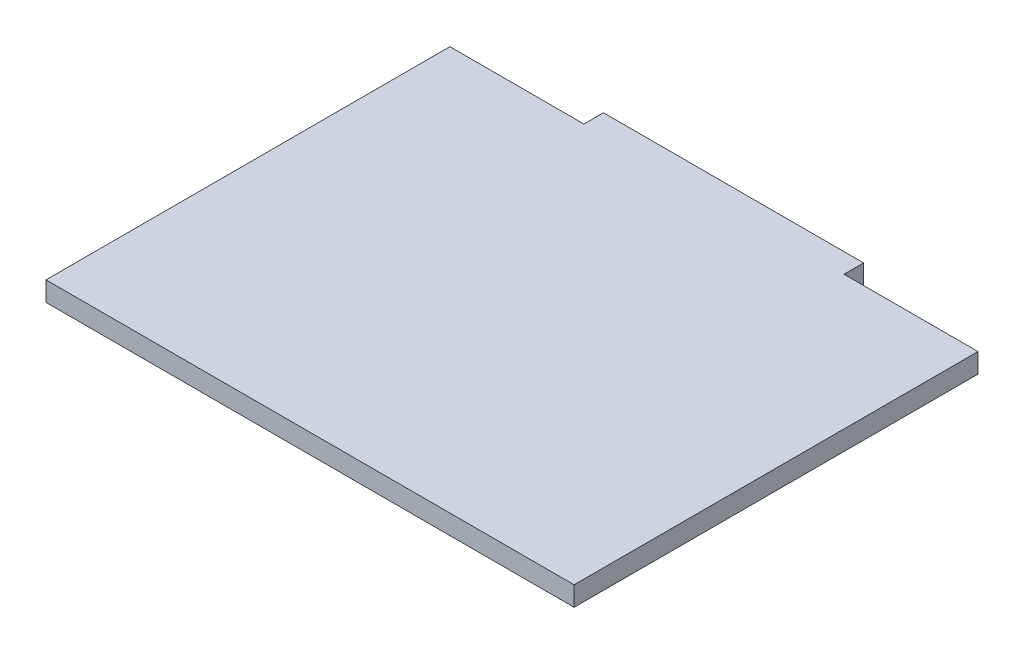
ISO-10303-21;
HEADER;
FILE_DESCRIPTION(('STEP AP214'),'2;1');
FILE_NAME('part.step','',(''),(''),'','','');
FILE_SCHEMA(('AUTOMOTIVE_DESIGN { 1 0 10303 214 1 1 1 1 }'));
ENDSEC;
DATA;
#1=APPLICATION_CONTEXT('core data for automotive mechanical design processes');
#2=APPLICATION_PROTOCOL_DEFINITION('international standard','automotive_design',2000,#1);
#3=PRODUCT_CONTEXT('',#1,'mechanical');
#4=PRODUCT('Part','Part','',(#3));
#5=PRODUCT_RELATED_PRODUCT_CATEGORY('part','',(#4));
#6=PRODUCT_DEFINITION_FORMATION('','',#4);
#7=PRODUCT_DEFINITION_CONTEXT('part definition',#1,'design');
#8=PRODUCT_DEFINITION('design','',#6,#7);
#9=PRODUCT_DEFINITION_SHAPE('','',#8);
#10=(LENGTH_UNIT() NAMED_UNIT(*) SI_UNIT(.MILLI.,.METRE.));
#11=(NAMED_UNIT(*) PLANE_ANGLE_UNIT() SI_UNIT($,.RADIAN.));
#12=(NAMED_UNIT(*) SI_UNIT($,.STERADIAN.) SOLID_ANGLE_UNIT());
#13=UNCERTAINTY_MEASURE_WITH_UNIT(LENGTH_MEASURE(1.E-05),#10,'distance_accuracy_value','');
#14=(GEOMETRIC_REPRESENTATION_CONTEXT(3) GLOBAL_UNCERTAINTY_ASSIGNED_CONTEXT((#13)) GLOBAL_UNIT_ASSIGNED_CONTEXT((#10,
#11,#12)) REPRESENTATION_CONTEXT('',''));
#15=CARTESIAN_POINT('',(0.,0.,0.));
#16=DIRECTION('',(0.,0.,1.));
#17=DIRECTION('',(1.,0.,0.));
#18=AXIS2_PLACEMENT_3D('',#15,#16,#17);
#19=CARTESIAN_POINT('',(0.,1.5,0.));
#20=DIRECTION('',(1.,0.,0.));
#21=DIRECTION('',(0.,0.,-1.));
#22=AXIS2_PLACEMENT_3D('',#19,#20,#21);
#23=PLANE('',#22);
#24=DIRECTION('',(0.,0.,1.));
#25=VECTOR('',#24,1.);
#26=CARTESIAN_POINT('',(0.,0.,0.));
#27=LINE('',#26,#25);
#28=CARTESIAN_POINT('',(0.,0.,-30.975));
#29=VERTEX_POINT('',#28);
#30=CARTESIAN_POINT('',(0.,0.,0.));
#31=VERTEX_POINT('',#30);
#32=EDGE_CURVE('E132',#29,#31,#27,.T.);
#33=ORIENTED_EDGE('',*,*,#32,.T.);
#34=DIRECTION('',(0.,-1.,0.));
#35=VECTOR('',#34,1.);
#36=CARTESIAN_POINT('',(0.,1.5,0.));
#37=LINE('',#36,#35);
#38=CARTESIAN_POINT('',(0.,1.5,0.));
#39=VERTEX_POINT('',#38);
#40=EDGE_CURVE('E11',#39,#31,#37,.T.);
#41=ORIENTED_EDGE('',*,*,#40,.F.);
#42=DIRECTION('',(0.,0.,1.));
#43=VECTOR('',#42,1.);
#44=CARTESIAN_POINT('',(0.,1.5,0.));
#45=LINE('',#44,#43);
#46=CARTESIAN_POINT('',(0.,1.5,-30.975));
#47=VERTEX_POINT('',#46);
#48=EDGE_CURVE('E146',#47,#39,#45,.T.);
#49=ORIENTED_EDGE('',*,*,#48,.F.);
#50=DIRECTION('',(0.,-1.,0.));
#51=VECTOR('',#50,1.);
#52=CARTESIAN_POINT('',(0.,1.5,-30.975));
#53=LINE('',#52,#51);
#54=EDGE_CURVE('E128',#47,#29,#53,.T.);
#55=ORIENTED_EDGE('',*,*,#54,.T.);
#56=EDGE_LOOP('',(#33,#41,#49,#55));
#57=FACE_BOUND('',#56,.T.);
#58=ADVANCED_FACE('F36',(#57),#23,.F.);
#59=CARTESIAN_POINT('',(0.,1.5,0.));
#60=DIRECTION('',(0.,0.,-1.));
#61=DIRECTION('',(-1.,0.,0.));
#62=AXIS2_PLACEMENT_3D('',#59,#60,#61);
#63=PLANE('',#62);
#64=DIRECTION('',(1.,0.,0.));
#65=VECTOR('',#64,1.);
#66=CARTESIAN_POINT('',(0.,0.,0.));
#67=LINE('',#66,#65);
#68=CARTESIAN_POINT('',(40.5,0.,0.));
#69=VERTEX_POINT('',#68);
#70=EDGE_CURVE('E135',#31,#69,#67,.T.);
#71=ORIENTED_EDGE('',*,*,#70,.T.);
#72=DIRECTION('',(0.,-1.,0.));
#73=VECTOR('',#72,1.);
#74=CARTESIAN_POINT('',(40.5,1.5,0.));
#75=LINE('',#74,#73);
#76=CARTESIAN_POINT('',(40.5,1.5,0.));
#77=VERTEX_POINT('',#76);
#78=EDGE_CURVE('E44',#77,#69,#75,.T.);
#79=ORIENTED_EDGE('',*,*,#78,.F.);
#80=DIRECTION('',(1.,0.,0.));
#81=VECTOR('',#80,1.);
#82=CARTESIAN_POINT('',(0.,1.5,0.));
#83=LINE('',#82,#81);
#84=EDGE_CURVE('E95',#39,#77,#83,.T.);
#85=ORIENTED_EDGE('',*,*,#84,.F.);
#86=ORIENTED_EDGE('',*,*,#40,.T.);
#87=EDGE_LOOP('',(#71,#79,#85,#86));
#88=FACE_BOUND('',#87,.T.);
#89=ADVANCED_FACE('F181',(#88),#63,.F.);
#90=CARTESIAN_POINT('',(40.5,1.5,0.));
#91=DIRECTION('',(-1.,0.,0.));
#92=DIRECTION('',(0.,0.,1.));
#93=AXIS2_PLACEMENT_3D('',#90,#91,#92);
#94=PLANE('',#93);
#95=DIRECTION('',(0.,0.,-1.));
#96=VECTOR('',#95,1.);
#97=CARTESIAN_POINT('',(40.5,0.,0.));
#98=LINE('',#97,#96);
#99=CARTESIAN_POINT('',(40.5,0.,-30.975));
#100=VERTEX_POINT('',#99);
#101=EDGE_CURVE('E137',#69,#100,#98,.T.);
#102=ORIENTED_EDGE('',*,*,#101,.T.);
#103=DIRECTION('',(0.,-1.,0.));
#104=VECTOR('',#103,1.);
#105=CARTESIAN_POINT('',(40.5,1.5,-30.975));
#106=LINE('',#105,#104);
#107=CARTESIAN_POINT('',(40.5,1.5,-30.975));
#108=VERTEX_POINT('',#107);
#109=EDGE_CURVE('E153',#108,#100,#106,.T.);
#110=ORIENTED_EDGE('',*,*,#109,.F.);
#111=DIRECTION('',(0.,0.,-1.));
#112=VECTOR('',#111,1.);
#113=CARTESIAN_POINT('',(40.5,1.5,0.));
#114=LINE('',#113,#112);
#115=EDGE_CURVE('E161',#77,#108,#114,.T.);
#116=ORIENTED_EDGE('',*,*,#115,.F.);
#117=ORIENTED_EDGE('',*,*,#78,.T.);
#118=EDGE_LOOP('',(#102,#110,#116,#117));
#119=FACE_BOUND('',#118,.T.);
#120=ADVANCED_FACE('F159',(#119),#94,.F.);
#121=CARTESIAN_POINT('',(40.5,1.5,-30.975));
#122=DIRECTION('',(0.,0.,1.));
#123=DIRECTION('',(1.,0.,0.));
#124=AXIS2_PLACEMENT_3D('',#121,#122,#123);
#125=PLANE('',#124);
#126=DIRECTION('',(-1.,0.,0.));
#127=VECTOR('',#126,1.);
#128=CARTESIAN_POINT('',(40.5,0.,-30.975));
#129=LINE('',#128,#127);
#130=CARTESIAN_POINT('',(30.225,0.,-30.975));
#131=VERTEX_POINT('',#130);
#132=EDGE_CURVE('E139',#100,#131,#129,.T.);
#133=ORIENTED_EDGE('',*,*,#132,.T.);
#134=DIRECTION('',(0.,-1.,0.));
#135=VECTOR('',#134,1.);
#136=CARTESIAN_POINT('',(30.225,1.5,-30.975));
#137=LINE('',#136,#135);
#138=CARTESIAN_POINT('',(30.225,1.5,-30.975));
#139=VERTEX_POINT('',#138);
#140=EDGE_CURVE('E150',#139,#131,#137,.T.);
#141=ORIENTED_EDGE('',*,*,#140,.F.);
#142=DIRECTION('',(-1.,0.,0.));
#143=VECTOR('',#142,1.);
#144=CARTESIAN_POINT('',(40.5,1.5,-30.975));
#145=LINE('',#144,#143);
#146=EDGE_CURVE('E173',#108,#139,#145,.T.);
#147=ORIENTED_EDGE('',*,*,#146,.F.);
#148=ORIENTED_EDGE('',*,*,#109,.T.);
#149=EDGE_LOOP('',(#133,#141,#147,#148));
#150=FACE_BOUND('',#149,.T.);
#151=ADVANCED_FACE('F169',(#150),#125,.F.);
#152=CARTESIAN_POINT('',(30.225,1.5,-32.475));
#153=DIRECTION('',(-1.,0.,0.));
#154=DIRECTION('',(0.,0.,1.));
#155=AXIS2_PLACEMENT_3D('',#152,#153,#154);
#156=PLANE('',#155);
#157=DIRECTION('',(0.,0.,-1.));
#158=VECTOR('',#157,1.);
#159=CARTESIAN_POINT('',(30.225,0.,-32.475));
#160=LINE('',#159,#158);
#161=CARTESIAN_POINT('',(30.225,0.,-32.475));
#162=VERTEX_POINT('',#161);
#163=EDGE_CURVE('E141',#131,#162,#160,.T.);
#164=ORIENTED_EDGE('',*,*,#163,.T.);
#165=DIRECTION('',(0.,-1.,0.));
#166=VECTOR('',#165,1.);
#167=CARTESIAN_POINT('',(30.225,1.5,-32.475));
#168=LINE('',#167,#166);
#169=CARTESIAN_POINT('',(30.225,1.5,-32.475));
#170=VERTEX_POINT('',#169);
#171=EDGE_CURVE('E123',#170,#162,#168,.T.);
#172=ORIENTED_EDGE('',*,*,#171,.F.);
#173=DIRECTION('',(0.,0.,-1.));
#174=VECTOR('',#173,1.);
#175=CARTESIAN_POINT('',(30.225,1.5,-32.475));
#176=LINE('',#175,#174);
#177=EDGE_CURVE('E114',#139,#170,#176,.T.);
#178=ORIENTED_EDGE('',*,*,#177,.F.);
#179=ORIENTED_EDGE('',*,*,#140,.T.);
#180=EDGE_LOOP('',(#164,#172,#178,#179));
#181=FACE_BOUND('',#180,.T.);
#182=ADVANCED_FACE('F172',(#181),#156,.F.);
#183=CARTESIAN_POINT('',(10.275,1.5,-32.475));
#184=DIRECTION('',(0.,0.,1.));
#185=DIRECTION('',(1.,0.,0.));
#186=AXIS2_PLACEMENT_3D('',#183,#184,#185);
#187=PLANE('',#186);
#188=DIRECTION('',(-1.,0.,0.));
#189=VECTOR('',#188,1.);
#190=CARTESIAN_POINT('',(10.275,0.,-32.475));
#191=LINE('',#190,#189);
#192=CARTESIAN_POINT('',(10.275,0.,-32.475));
#193=VERTEX_POINT('',#192);
#194=EDGE_CURVE('E122',#162,#193,#191,.T.);
#195=ORIENTED_EDGE('',*,*,#194,.T.);
#196=DIRECTION('',(0.,-1.,0.));
#197=VECTOR('',#196,1.);
#198=CARTESIAN_POINT('',(10.275,1.5,-32.475));
#199=LINE('',#198,#197);
#200=CARTESIAN_POINT('',(10.275,1.5,-32.475));
#201=VERTEX_POINT('',#200);
#202=EDGE_CURVE('E119',#201,#193,#199,.T.);
#203=ORIENTED_EDGE('',*,*,#202,.F.);
#204=DIRECTION('',(-1.,0.,0.));
#205=VECTOR('',#204,1.);
#206=CARTESIAN_POINT('',(10.275,1.5,-32.475));
#207=LINE('',#206,#205);
#208=EDGE_CURVE('E108',#170,#201,#207,.T.);
#209=ORIENTED_EDGE('',*,*,#208,.F.);
#210=ORIENTED_EDGE('',*,*,#171,.T.);
#211=EDGE_LOOP('',(#195,#203,#209,#210));
#212=FACE_BOUND('',#211,.T.);
#213=ADVANCED_FACE('F120',(#212),#187,.F.);
#214=CARTESIAN_POINT('',(10.275,1.5,-32.475));
#215=DIRECTION('',(1.,0.,0.));
#216=DIRECTION('',(0.,0.,-1.));
#217=AXIS2_PLACEMENT_3D('',#214,#215,#216);
#218=PLANE('',#217);
#219=DIRECTION('',(0.,0.,1.));
#220=VECTOR('',#219,1.);
#221=CARTESIAN_POINT('',(10.275,0.,-32.475));
#222=LINE('',#221,#220);
#223=CARTESIAN_POINT('',(10.275,0.,-30.975));
#224=VERTEX_POINT('',#223);
#225=EDGE_CURVE('E81',#193,#224,#222,.T.);
#226=ORIENTED_EDGE('',*,*,#225,.T.);
#227=DIRECTION('',(0.,-1.,0.));
#228=VECTOR('',#227,1.);
#229=CARTESIAN_POINT('',(10.275,1.5,-30.975));
#230=LINE('',#229,#228);
#231=CARTESIAN_POINT('',(10.275,1.5,-30.975));
#232=VERTEX_POINT('',#231);
#233=EDGE_CURVE('E124',#232,#224,#230,.T.);
#234=ORIENTED_EDGE('',*,*,#233,.F.);
#235=DIRECTION('',(0.,0.,1.));
#236=VECTOR('',#235,1.);
#237=CARTESIAN_POINT('',(10.275,1.5,-32.475));
#238=LINE('',#237,#236);
#239=EDGE_CURVE('E112',#201,#232,#238,.T.);
#240=ORIENTED_EDGE('',*,*,#239,.F.);
#241=ORIENTED_EDGE('',*,*,#202,.T.);
#242=EDGE_LOOP('',(#226,#234,#240,#241));
#243=FACE_BOUND('',#242,.T.);
#244=ADVANCED_FACE('F126',(#243),#218,.F.);
#245=CARTESIAN_POINT('',(0.,1.5,-30.975));
#246=DIRECTION('',(0.,0.,1.));
#247=DIRECTION('',(1.,0.,0.));
#248=AXIS2_PLACEMENT_3D('',#245,#246,#247);
#249=PLANE('',#248);
#250=DIRECTION('',(-1.,0.,0.));
#251=VECTOR('',#250,1.);
#252=CARTESIAN_POINT('',(0.,0.,-30.975));
#253=LINE('',#252,#251);
#254=EDGE_CURVE('E87',#224,#29,#253,.T.);
#255=ORIENTED_EDGE('',*,*,#254,.T.);
#256=ORIENTED_EDGE('',*,*,#54,.F.);
#257=DIRECTION('',(-1.,0.,0.));
#258=VECTOR('',#257,1.);
#259=CARTESIAN_POINT('',(0.,1.5,-30.975));
#260=LINE('',#259,#258);
#261=EDGE_CURVE('E52',#232,#47,#260,.T.);
#262=ORIENTED_EDGE('',*,*,#261,.F.);
#263=ORIENTED_EDGE('',*,*,#233,.T.);
#264=EDGE_LOOP('',(#255,#256,#262,#263));
#265=FACE_BOUND('',#264,.T.);
#266=ADVANCED_FACE('F197',(#265),#249,.F.);
#267=CARTESIAN_POINT('',(0.,1.5,0.));
#268=DIRECTION('',(0.,-1.,0.));
#269=DIRECTION('',(0.,0.,-1.));
#270=AXIS2_PLACEMENT_3D('',#267,#268,#269);
#271=PLANE('',#270);
#272=ORIENTED_EDGE('',*,*,#48,.T.);
#273=ORIENTED_EDGE('',*,*,#84,.T.);
#274=ORIENTED_EDGE('',*,*,#115,.T.);
#275=ORIENTED_EDGE('',*,*,#146,.T.);
#276=ORIENTED_EDGE('',*,*,#177,.T.);
#277=ORIENTED_EDGE('',*,*,#208,.T.);
#278=ORIENTED_EDGE('',*,*,#239,.T.);
#279=ORIENTED_EDGE('',*,*,#261,.T.);
#280=EDGE_LOOP('',(#272,#273,#274,#275,#276,#277,#278,#279));
#281=FACE_BOUND('',#280,.T.);
#282=ADVANCED_FACE('F110',(#281),#271,.F.);
#283=CARTESIAN_POINT('',(0.,0.,0.));
#284=DIRECTION('',(0.,-1.,0.));
#285=DIRECTION('',(0.,0.,-1.));
#286=AXIS2_PLACEMENT_3D('',#283,#284,#285);
#287=PLANE('',#286);
#288=ORIENTED_EDGE('',*,*,#32,.F.);
#289=ORIENTED_EDGE('',*,*,#254,.F.);
#290=ORIENTED_EDGE('',*,*,#225,.F.);
#291=ORIENTED_EDGE('',*,*,#194,.F.);
#292=ORIENTED_EDGE('',*,*,#163,.F.);
#293=ORIENTED_EDGE('',*,*,#132,.F.);
#294=ORIENTED_EDGE('',*,*,#101,.F.);
#295=ORIENTED_EDGE('',*,*,#70,.F.);
#296=EDGE_LOOP('',(#288,#289,#290,#291,#292,#293,#294,#295));
#297=FACE_BOUND('',#296,.T.);
#298=ADVANCED_FACE('F165',(#297),#287,.T.);
#299=CLOSED_SHELL('',(#58,#89,#120,#151,#182,#213,#244,#266,#282,#298));
#300=MANIFOLD_SOLID_BREP('B2',#299);
#301=ADVANCED_BREP_SHAPE_REPRESENTATION('',(#18,#300),#14);
#302=SHAPE_DEFINITION_REPRESENTATION(#9,#301);
ENDSEC;
END-ISO-10303-21;
